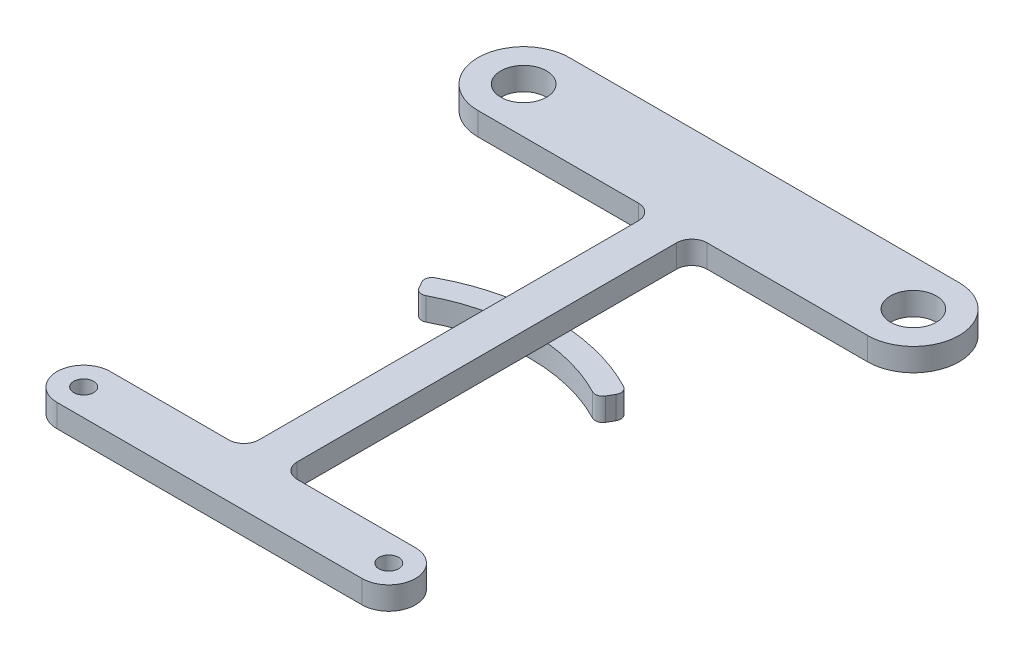
ISO-10303-21;
HEADER;
FILE_DESCRIPTION(('STEP AP214'),'2;1');
FILE_NAME('part.step','',(''),(''),'','','');
FILE_SCHEMA(('AUTOMOTIVE_DESIGN { 1 0 10303 214 1 1 1 1 }'));
ENDSEC;
DATA;
#1=APPLICATION_CONTEXT('core data for automotive mechanical design processes');
#2=APPLICATION_PROTOCOL_DEFINITION('international standard','automotive_design',2000,#1);
#3=PRODUCT_CONTEXT('',#1,'mechanical');
#4=PRODUCT('Part','Part','',(#3));
#5=PRODUCT_RELATED_PRODUCT_CATEGORY('part','',(#4));
#6=PRODUCT_DEFINITION_FORMATION('','',#4);
#7=PRODUCT_DEFINITION_CONTEXT('part definition',#1,'design');
#8=PRODUCT_DEFINITION('design','',#6,#7);
#9=PRODUCT_DEFINITION_SHAPE('','',#8);
#10=(LENGTH_UNIT() NAMED_UNIT(*) SI_UNIT(.MILLI.,.METRE.));
#11=(NAMED_UNIT(*) PLANE_ANGLE_UNIT() SI_UNIT($,.RADIAN.));
#12=(NAMED_UNIT(*) SI_UNIT($,.STERADIAN.) SOLID_ANGLE_UNIT());
#13=UNCERTAINTY_MEASURE_WITH_UNIT(LENGTH_MEASURE(1.E-05),#10,'distance_accuracy_value','');
#14=(GEOMETRIC_REPRESENTATION_CONTEXT(3) GLOBAL_UNCERTAINTY_ASSIGNED_CONTEXT((#13)) GLOBAL_UNIT_ASSIGNED_CONTEXT((#10,
#11,#12)) REPRESENTATION_CONTEXT('',''));
#15=CARTESIAN_POINT('',(0.,0.,0.));
#16=DIRECTION('',(0.,0.,1.));
#17=DIRECTION('',(1.,0.,0.));
#18=AXIS2_PLACEMENT_3D('',#15,#16,#17);
#19=CARTESIAN_POINT('',(-20.,0.,15.));
#20=DIRECTION('',(0.,1.,0.));
#21=DIRECTION('',(0.,0.,1.));
#22=AXIS2_PLACEMENT_3D('',#19,#20,#21);
#23=PLANE('',#22);
#24=CARTESIAN_POINT('',(25.55,0.,-48.24));
#25=DIRECTION('',(0.,1.,0.));
#26=DIRECTION('',(0.,0.,1.));
#27=AXIS2_PLACEMENT_3D('',#24,#25,#26);
#28=CIRCLE('',#27,3.);
#29=CARTESIAN_POINT('',(25.55,0.,-45.24));
#30=VERTEX_POINT('',#29);
#31=EDGE_CURVE('E627',#30,#30,#28,.T.);
#32=ORIENTED_EDGE('',*,*,#31,.T.);
#33=EDGE_LOOP('',(#32));
#34=FACE_BOUND('',#33,.T.);
#35=CARTESIAN_POINT('',(-25.55,0.,-48.24));
#36=DIRECTION('',(0.,1.,0.));
#37=DIRECTION('',(0.,0.,1.));
#38=AXIS2_PLACEMENT_3D('',#35,#36,#37);
#39=CIRCLE('',#38,3.);
#40=CARTESIAN_POINT('',(-25.55,0.,-45.24));
#41=VERTEX_POINT('',#40);
#42=EDGE_CURVE('E602',#41,#41,#39,.T.);
#43=ORIENTED_EDGE('',*,*,#42,.T.);
#44=EDGE_LOOP('',(#43));
#45=FACE_BOUND('',#44,.T.);
#46=DIRECTION('',(0.,0.,-1.));
#47=VECTOR('',#46,1.);
#48=CARTESIAN_POINT('',(2.5,0.,-42.2399996259733));
#49=LINE('',#48,#47);
#50=CARTESIAN_POINT('',(2.5,0.,-26.3818119165458));
#51=VERTEX_POINT('',#50);
#52=CARTESIAN_POINT('',(2.5,0.,-40.2399996259732));
#53=VERTEX_POINT('',#52);
#54=EDGE_CURVE('E245',#51,#53,#49,.T.);
#55=ORIENTED_EDGE('',*,*,#54,.F.);
#56=CARTESIAN_POINT('',(0.,0.,0.));
#57=DIRECTION('',(0.,1.,0.));
#58=DIRECTION('',(0.,0.,1.));
#59=AXIS2_PLACEMENT_3D('',#56,#57,#58);
#60=CIRCLE('',#59,26.5);
#61=CARTESIAN_POINT('',(-2.5,0.,-26.3818119165458));
#62=VERTEX_POINT('',#61);
#63=EDGE_CURVE('E231',#51,#62,#60,.T.);
#64=ORIENTED_EDGE('',*,*,#63,.T.);
#65=DIRECTION('',(0.,0.,1.));
#66=VECTOR('',#65,1.);
#67=CARTESIAN_POINT('',(-2.5,0.,-42.2399996259733));
#68=LINE('',#67,#66);
#69=CARTESIAN_POINT('',(-2.5,0.,-40.2399996259732));
#70=VERTEX_POINT('',#69);
#71=EDGE_CURVE('E280',#70,#62,#68,.T.);
#72=ORIENTED_EDGE('',*,*,#71,.F.);
#73=CARTESIAN_POINT('',(-4.5,0.,-40.2399996259732));
#74=DIRECTION('',(0.,1.,0.));
#75=DIRECTION('',(0.,0.,1.));
#76=AXIS2_PLACEMENT_3D('',#73,#74,#75);
#77=CIRCLE('',#76,2.);
#78=CARTESIAN_POINT('',(-4.5,0.,-42.2399996259733));
#79=VERTEX_POINT('',#78);
#80=EDGE_CURVE('E396',#70,#79,#77,.T.);
#81=ORIENTED_EDGE('',*,*,#80,.T.);
#82=DIRECTION('',(1.,0.,0.));
#83=VECTOR('',#82,1.);
#84=CARTESIAN_POINT('',(-25.55,0.,-42.2399996259732));
#85=LINE('',#84,#83);
#86=CARTESIAN_POINT('',(-25.55,0.,-42.2399996259732));
#87=VERTEX_POINT('',#86);
#88=EDGE_CURVE('E275',#87,#79,#85,.T.);
#89=ORIENTED_EDGE('',*,*,#88,.F.);
#90=CARTESIAN_POINT('',(-25.55,0.,-48.24));
#91=DIRECTION('',(0.,1.,0.));
#92=DIRECTION('',(0.,0.,1.));
#93=AXIS2_PLACEMENT_3D('',#90,#91,#92);
#94=CIRCLE('',#93,6.00000037402676);
#95=CARTESIAN_POINT('',(-25.55,0.,-54.2400003740268));
#96=VERTEX_POINT('',#95);
#97=EDGE_CURVE('E272',#96,#87,#94,.T.);
#98=ORIENTED_EDGE('',*,*,#97,.F.);
#99=DIRECTION('',(-1.,0.,0.));
#100=VECTOR('',#99,1.);
#101=CARTESIAN_POINT('',(-25.55,0.,-54.2400003740268));
#102=LINE('',#101,#100);
#103=CARTESIAN_POINT('',(25.55,0.,-54.2400003740268));
#104=VERTEX_POINT('',#103);
#105=EDGE_CURVE('E269',#104,#96,#102,.T.);
#106=ORIENTED_EDGE('',*,*,#105,.F.);
#107=CARTESIAN_POINT('',(25.55,0.,-48.24));
#108=DIRECTION('',(0.,1.,0.));
#109=DIRECTION('',(0.,0.,1.));
#110=AXIS2_PLACEMENT_3D('',#107,#108,#109);
#111=CIRCLE('',#110,6.00000037402676);
#112=CARTESIAN_POINT('',(25.55,0.,-42.2399996259732));
#113=VERTEX_POINT('',#112);
#114=EDGE_CURVE('E266',#113,#104,#111,.T.);
#115=ORIENTED_EDGE('',*,*,#114,.F.);
#116=DIRECTION('',(1.,0.,0.));
#117=VECTOR('',#116,1.);
#118=CARTESIAN_POINT('',(2.5,0.,-42.2399996259733));
#119=LINE('',#118,#117);
#120=CARTESIAN_POINT('',(4.5,0.,-42.2399996259733));
#121=VERTEX_POINT('',#120);
#122=EDGE_CURVE('E260',#121,#113,#119,.T.);
#123=ORIENTED_EDGE('',*,*,#122,.F.);
#124=CARTESIAN_POINT('',(4.5,0.,-40.2399996259732));
#125=DIRECTION('',(0.,1.,0.));
#126=DIRECTION('',(0.,0.,1.));
#127=AXIS2_PLACEMENT_3D('',#124,#125,#126);
#128=CIRCLE('',#127,2.);
#129=EDGE_CURVE('E247',#121,#53,#128,.T.);
#130=ORIENTED_EDGE('',*,*,#129,.T.);
#131=EDGE_LOOP('',(#55,#64,#72,#81,#89,#98,#106,#115,#123,#130));
#132=FACE_BOUND('',#131,.T.);
#133=ADVANCED_FACE('F43',(#34,#45,#132),#23,.F.);
#134=CARTESIAN_POINT('',(20.,0.,14.9999999999999));
#135=DIRECTION('',(0.,1.,0.));
#136=DIRECTION('',(0.,0.,1.));
#137=AXIS2_PLACEMENT_3D('',#134,#135,#136);
#138=CIRCLE('',#137,1.3);
#139=CARTESIAN_POINT('',(20.,0.,16.2999999999999));
#140=VERTEX_POINT('',#139);
#141=EDGE_CURVE('E633',#140,#140,#138,.T.);
#142=ORIENTED_EDGE('',*,*,#141,.T.);
#143=EDGE_LOOP('',(#142));
#144=FACE_BOUND('',#143,.T.);
#145=CARTESIAN_POINT('',(-20.,0.,15.));
#146=DIRECTION('',(0.,1.,0.));
#147=DIRECTION('',(0.,0.,1.));
#148=AXIS2_PLACEMENT_3D('',#145,#146,#147);
#149=CIRCLE('',#148,1.29999999999999);
#150=CARTESIAN_POINT('',(-20.,0.,16.3));
#151=VERTEX_POINT('',#150);
#152=EDGE_CURVE('E640',#151,#151,#149,.T.);
#153=ORIENTED_EDGE('',*,*,#152,.T.);
#154=EDGE_LOOP('',(#153));
#155=FACE_BOUND('',#154,.T.);
#156=CARTESIAN_POINT('',(-2.5,0.,-23.3666428910958));
#157=VERTEX_POINT('',#156);
#158=CARTESIAN_POINT('',(-2.49999999999999,0.,9.50000148501656));
#159=VERTEX_POINT('',#158);
#160=EDGE_CURVE('E279',#157,#159,#68,.T.);
#161=ORIENTED_EDGE('',*,*,#160,.F.);
#162=CARTESIAN_POINT('',(0.,0.,0.));
#163=DIRECTION('',(0.,-1.,0.));
#164=DIRECTION('',(0.,0.,1.));
#165=AXIS2_PLACEMENT_3D('',#162,#163,#164);
#166=CIRCLE('',#165,23.5);
#167=CARTESIAN_POINT('',(2.5,0.,-23.3666428910958));
#168=VERTEX_POINT('',#167);
#169=EDGE_CURVE('E243',#157,#168,#166,.T.);
#170=ORIENTED_EDGE('',*,*,#169,.T.);
#171=CARTESIAN_POINT('',(2.5,0.,9.50000234728425));
#172=VERTEX_POINT('',#171);
#173=EDGE_CURVE('E253',#172,#168,#49,.T.);
#174=ORIENTED_EDGE('',*,*,#173,.F.);
#175=CARTESIAN_POINT('',(4.5,0.,9.50000234728425));
#176=DIRECTION('',(0.,1.,0.));
#177=DIRECTION('',(0.,0.,1.));
#178=AXIS2_PLACEMENT_3D('',#175,#176,#177);
#179=CIRCLE('',#178,2.);
#180=CARTESIAN_POINT('',(4.49999980838496,0.,11.5000023472842));
#181=VERTEX_POINT('',#180);
#182=EDGE_CURVE('E407',#172,#181,#179,.T.);
#183=ORIENTED_EDGE('',*,*,#182,.T.);
#184=DIRECTION('',(-0.999999999999995,0.,-9.58075209445119E-08));
#185=VECTOR('',#184,1.);
#186=CARTESIAN_POINT('',(2.5,0.,11.5000021556692));
#187=LINE('',#186,#185);
#188=CARTESIAN_POINT('',(20.0000000000001,0.,11.5000038323008));
#189=VERTEX_POINT('',#188);
#190=EDGE_CURVE('E251',#189,#181,#187,.T.);
#191=ORIENTED_EDGE('',*,*,#190,.F.);
#192=CARTESIAN_POINT('',(20.,0.,14.9999999999999));
#193=DIRECTION('',(0.,1.,0.));
#194=DIRECTION('',(0.,0.,1.));
#195=AXIS2_PLACEMENT_3D('',#192,#193,#194);
#196=CIRCLE('',#195,3.49999616769917);
#197=CARTESIAN_POINT('',(20.0000000000001,0.,18.4999961676991));
#198=VERTEX_POINT('',#197);
#199=EDGE_CURVE('E445',#198,#189,#196,.T.);
#200=ORIENTED_EDGE('',*,*,#199,.F.);
#201=DIRECTION('',(0.999999999999995,0.,-9.5807520857776E-08));
#202=VECTOR('',#201,1.);
#203=CARTESIAN_POINT('',(-20.,0.,18.5));
#204=LINE('',#203,#202);
#205=CARTESIAN_POINT('',(-20.,0.,18.5));
#206=VERTEX_POINT('',#205);
#207=EDGE_CURVE('E442',#206,#198,#204,.T.);
#208=ORIENTED_EDGE('',*,*,#207,.F.);
#209=CARTESIAN_POINT('',(-20.,0.,15.));
#210=DIRECTION('',(0.,1.,0.));
#211=DIRECTION('',(0.,0.,1.));
#212=AXIS2_PLACEMENT_3D('',#209,#210,#211);
#213=CIRCLE('',#212,3.5);
#214=CARTESIAN_POINT('',(-20.,0.,11.5));
#215=VERTEX_POINT('',#214);
#216=EDGE_CURVE('E438',#215,#206,#213,.T.);
#217=ORIENTED_EDGE('',*,*,#216,.F.);
#218=DIRECTION('',(-0.999999999999995,0.,-9.58075208453854E-08));
#219=VECTOR('',#218,1.);
#220=CARTESIAN_POINT('',(-20.,0.,11.5));
#221=LINE('',#220,#219);
#222=CARTESIAN_POINT('',(-4.50000019161503,0.,11.5000014850166));
#223=VERTEX_POINT('',#222);
#224=EDGE_CURVE('E283',#223,#215,#221,.T.);
#225=ORIENTED_EDGE('',*,*,#224,.F.);
#226=CARTESIAN_POINT('',(-4.49999999999999,0.,9.50000148501656));
#227=DIRECTION('',(0.,1.,0.));
#228=DIRECTION('',(0.,0.,1.));
#229=AXIS2_PLACEMENT_3D('',#226,#227,#228);
#230=CIRCLE('',#229,2.);
#231=EDGE_CURVE('E52',#223,#159,#230,.T.);
#232=ORIENTED_EDGE('',*,*,#231,.T.);
#233=EDGE_LOOP('',(#161,#170,#174,#183,#191,#200,#208,#217,#225,#232));
#234=FACE_BOUND('',#233,.T.);
#235=ADVANCED_FACE('F417',(#144,#155,#234),#23,.F.);
#236=CARTESIAN_POINT('',(-20.,3.,15.));
#237=DIRECTION('',(0.,1.,0.));
#238=DIRECTION('',(0.,0.,1.));
#239=AXIS2_PLACEMENT_3D('',#236,#237,#238);
#240=PLANE('',#239);
#241=CARTESIAN_POINT('',(25.55,3.,-48.24));
#242=DIRECTION('',(0.,1.,0.));
#243=DIRECTION('',(0.,0.,1.));
#244=AXIS2_PLACEMENT_3D('',#241,#242,#243);
#245=CIRCLE('',#244,3.);
#246=CARTESIAN_POINT('',(25.55,3.,-45.24));
#247=VERTEX_POINT('',#246);
#248=EDGE_CURVE('E629',#247,#247,#245,.T.);
#249=ORIENTED_EDGE('',*,*,#248,.F.);
#250=EDGE_LOOP('',(#249));
#251=FACE_BOUND('',#250,.T.);
#252=CARTESIAN_POINT('',(-20.,3.,15.));
#253=DIRECTION('',(0.,1.,0.));
#254=DIRECTION('',(0.,0.,1.));
#255=AXIS2_PLACEMENT_3D('',#252,#253,#254);
#256=CIRCLE('',#255,1.29999999999999);
#257=CARTESIAN_POINT('',(-20.,3.,16.3));
#258=VERTEX_POINT('',#257);
#259=EDGE_CURVE('E443',#258,#258,#256,.T.);
#260=ORIENTED_EDGE('',*,*,#259,.F.);
#261=EDGE_LOOP('',(#260));
#262=FACE_BOUND('',#261,.T.);
#263=CARTESIAN_POINT('',(-20.,3.,15.));
#264=DIRECTION('',(0.,1.,0.));
#265=DIRECTION('',(0.,0.,1.));
#266=AXIS2_PLACEMENT_3D('',#263,#264,#265);
#267=CIRCLE('',#266,3.5);
#268=CARTESIAN_POINT('',(-20.,3.,11.5));
#269=VERTEX_POINT('',#268);
#270=CARTESIAN_POINT('',(-20.,3.,18.5));
#271=VERTEX_POINT('',#270);
#272=EDGE_CURVE('E287',#269,#271,#267,.T.);
#273=ORIENTED_EDGE('',*,*,#272,.T.);
#274=DIRECTION('',(0.999999999999995,0.,-9.5807520857776E-08));
#275=VECTOR('',#274,1.);
#276=CARTESIAN_POINT('',(-20.,3.,18.5));
#277=LINE('',#276,#275);
#278=CARTESIAN_POINT('',(20.0000000000001,3.,18.4999961676991));
#279=VERTEX_POINT('',#278);
#280=EDGE_CURVE('E652',#271,#279,#277,.T.);
#281=ORIENTED_EDGE('',*,*,#280,.T.);
#282=CARTESIAN_POINT('',(20.,3.,14.9999999999999));
#283=DIRECTION('',(0.,1.,0.));
#284=DIRECTION('',(0.,0.,1.));
#285=AXIS2_PLACEMENT_3D('',#282,#283,#284);
#286=CIRCLE('',#285,3.49999616769917);
#287=CARTESIAN_POINT('',(20.0000000000001,3.,11.5000038323008));
#288=VERTEX_POINT('',#287);
#289=EDGE_CURVE('E476',#279,#288,#286,.T.);
#290=ORIENTED_EDGE('',*,*,#289,.T.);
#291=DIRECTION('',(-0.999999999999995,0.,-9.58075209445119E-08));
#292=VECTOR('',#291,1.);
#293=CARTESIAN_POINT('',(2.5,3.,11.5000021556692));
#294=LINE('',#293,#292);
#295=CARTESIAN_POINT('',(4.49999980838496,3.,11.5000023472842));
#296=VERTEX_POINT('',#295);
#297=EDGE_CURVE('E468',#288,#296,#294,.T.);
#298=ORIENTED_EDGE('',*,*,#297,.T.);
#299=CARTESIAN_POINT('',(4.5,3.,9.50000234728425));
#300=DIRECTION('',(0.,1.,0.));
#301=DIRECTION('',(0.,0.,1.));
#302=AXIS2_PLACEMENT_3D('',#299,#300,#301);
#303=CIRCLE('',#302,2.);
#304=CARTESIAN_POINT('',(2.5,3.,9.50000234728425));
#305=VERTEX_POINT('',#304);
#306=EDGE_CURVE('E410',#296,#305,#303,.F.);
#307=ORIENTED_EDGE('',*,*,#306,.T.);
#308=DIRECTION('',(0.,0.,-1.));
#309=VECTOR('',#308,1.);
#310=CARTESIAN_POINT('',(2.5,3.,-42.2399996259733));
#311=LINE('',#310,#309);
#312=CARTESIAN_POINT('',(2.5,3.,-40.2399996259732));
#313=VERTEX_POINT('',#312);
#314=EDGE_CURVE('E466',#305,#313,#311,.T.);
#315=ORIENTED_EDGE('',*,*,#314,.T.);
#316=CARTESIAN_POINT('',(4.5,3.,-40.2399996259732));
#317=DIRECTION('',(0.,1.,0.));
#318=DIRECTION('',(0.,0.,1.));
#319=AXIS2_PLACEMENT_3D('',#316,#317,#318);
#320=CIRCLE('',#319,2.);
#321=CARTESIAN_POINT('',(4.5,3.,-42.2399996259733));
#322=VERTEX_POINT('',#321);
#323=EDGE_CURVE('E404',#313,#322,#320,.F.);
#324=ORIENTED_EDGE('',*,*,#323,.T.);
#325=DIRECTION('',(1.,0.,0.));
#326=VECTOR('',#325,1.);
#327=CARTESIAN_POINT('',(2.5,3.,-42.2399996259733));
#328=LINE('',#327,#326);
#329=CARTESIAN_POINT('',(25.55,3.,-42.2399996259732));
#330=VERTEX_POINT('',#329);
#331=EDGE_CURVE('E470',#322,#330,#328,.T.);
#332=ORIENTED_EDGE('',*,*,#331,.T.);
#333=CARTESIAN_POINT('',(25.55,3.,-48.24));
#334=DIRECTION('',(0.,1.,0.));
#335=DIRECTION('',(0.,0.,1.));
#336=AXIS2_PLACEMENT_3D('',#333,#334,#335);
#337=CIRCLE('',#336,6.00000037402676);
#338=CARTESIAN_POINT('',(25.55,3.,-54.2400003740268));
#339=VERTEX_POINT('',#338);
#340=EDGE_CURVE('E474',#330,#339,#337,.T.);
#341=ORIENTED_EDGE('',*,*,#340,.T.);
#342=DIRECTION('',(-1.,0.,0.));
#343=VECTOR('',#342,1.);
#344=CARTESIAN_POINT('',(-25.55,3.,-54.2400003740268));
#345=LINE('',#344,#343);
#346=CARTESIAN_POINT('',(-25.55,3.,-54.2400003740268));
#347=VERTEX_POINT('',#346);
#348=EDGE_CURVE('E482',#339,#347,#345,.T.);
#349=ORIENTED_EDGE('',*,*,#348,.T.);
#350=CARTESIAN_POINT('',(-25.55,3.,-48.24));
#351=DIRECTION('',(0.,1.,0.));
#352=DIRECTION('',(0.,0.,1.));
#353=AXIS2_PLACEMENT_3D('',#350,#351,#352);
#354=CIRCLE('',#353,6.00000037402676);
#355=CARTESIAN_POINT('',(-25.55,3.,-42.2399996259732));
#356=VERTEX_POINT('',#355);
#357=EDGE_CURVE('E485',#347,#356,#354,.T.);
#358=ORIENTED_EDGE('',*,*,#357,.T.);
#359=DIRECTION('',(1.,0.,0.));
#360=VECTOR('',#359,1.);
#361=CARTESIAN_POINT('',(-25.55,3.,-42.2399996259732));
#362=LINE('',#361,#360);
#363=CARTESIAN_POINT('',(-4.5,3.,-42.2399996259733));
#364=VERTEX_POINT('',#363);
#365=EDGE_CURVE('E434',#356,#364,#362,.T.);
#366=ORIENTED_EDGE('',*,*,#365,.T.);
#367=CARTESIAN_POINT('',(-4.5,3.,-40.2399996259732));
#368=DIRECTION('',(0.,1.,0.));
#369=DIRECTION('',(0.,0.,1.));
#370=AXIS2_PLACEMENT_3D('',#367,#368,#369);
#371=CIRCLE('',#370,2.);
#372=CARTESIAN_POINT('',(-2.5,3.,-40.2399996259732));
#373=VERTEX_POINT('',#372);
#374=EDGE_CURVE('E399',#364,#373,#371,.F.);
#375=ORIENTED_EDGE('',*,*,#374,.T.);
#376=DIRECTION('',(0.,0.,1.));
#377=VECTOR('',#376,1.);
#378=CARTESIAN_POINT('',(-2.5,3.,-42.2399996259733));
#379=LINE('',#378,#377);
#380=CARTESIAN_POINT('',(-2.49999999999999,3.,9.50000148501656));
#381=VERTEX_POINT('',#380);
#382=EDGE_CURVE('E431',#373,#381,#379,.T.);
#383=ORIENTED_EDGE('',*,*,#382,.T.);
#384=CARTESIAN_POINT('',(-4.49999999999999,3.,9.50000148501656));
#385=DIRECTION('',(0.,1.,0.));
#386=DIRECTION('',(0.,0.,1.));
#387=AXIS2_PLACEMENT_3D('',#384,#385,#386);
#388=CIRCLE('',#387,2.);
#389=CARTESIAN_POINT('',(-4.50000019161503,3.,11.5000014850166));
#390=VERTEX_POINT('',#389);
#391=EDGE_CURVE('E11',#381,#390,#388,.F.);
#392=ORIENTED_EDGE('',*,*,#391,.T.);
#393=DIRECTION('',(-0.999999999999995,0.,-9.58075208453854E-08));
#394=VECTOR('',#393,1.);
#395=CARTESIAN_POINT('',(-20.,3.,11.5));
#396=LINE('',#395,#394);
#397=EDGE_CURVE('E293',#390,#269,#396,.T.);
#398=ORIENTED_EDGE('',*,*,#397,.T.);
#399=EDGE_LOOP('',(#273,#281,#290,#298,#307,#315,#324,#332,#341,#349,#358,#366,#375,#383,#392,#398));
#400=FACE_BOUND('',#399,.T.);
#401=CARTESIAN_POINT('',(20.,3.,14.9999999999999));
#402=DIRECTION('',(0.,1.,0.));
#403=DIRECTION('',(0.,0.,1.));
#404=AXIS2_PLACEMENT_3D('',#401,#402,#403);
#405=CIRCLE('',#404,1.3);
#406=CARTESIAN_POINT('',(20.,3.,16.2999999999999));
#407=VERTEX_POINT('',#406);
#408=EDGE_CURVE('E636',#407,#407,#405,.T.);
#409=ORIENTED_EDGE('',*,*,#408,.F.);
#410=EDGE_LOOP('',(#409));
#411=FACE_BOUND('',#410,.T.);
#412=CARTESIAN_POINT('',(-25.55,3.,-48.24));
#413=DIRECTION('',(0.,1.,0.));
#414=DIRECTION('',(0.,0.,1.));
#415=AXIS2_PLACEMENT_3D('',#412,#413,#414);
#416=CIRCLE('',#415,3.);
#417=CARTESIAN_POINT('',(-25.55,3.,-45.24));
#418=VERTEX_POINT('',#417);
#419=EDGE_CURVE('E608',#418,#418,#416,.T.);
#420=ORIENTED_EDGE('',*,*,#419,.F.);
#421=EDGE_LOOP('',(#420));
#422=FACE_BOUND('',#421,.T.);
#423=ADVANCED_FACE('F464',(#251,#262,#400,#411,#422),#240,.T.);
#424=CARTESIAN_POINT('',(-20.,3.,15.));
#425=DIRECTION('',(0.,-1.,0.));
#426=DIRECTION('',(0.,0.,-1.));
#427=AXIS2_PLACEMENT_3D('',#424,#425,#426);
#428=CYLINDRICAL_SURFACE('',#427,3.5);
#429=ORIENTED_EDGE('',*,*,#216,.T.);
#430=DIRECTION('',(0.,-1.,0.));
#431=VECTOR('',#430,1.);
#432=CARTESIAN_POINT('',(-20.,3.,18.5));
#433=LINE('',#432,#431);
#434=EDGE_CURVE('E317',#271,#206,#433,.T.);
#435=ORIENTED_EDGE('',*,*,#434,.F.);
#436=ORIENTED_EDGE('',*,*,#272,.F.);
#437=DIRECTION('',(0.,-1.,0.));
#438=VECTOR('',#437,1.);
#439=CARTESIAN_POINT('',(-20.,3.,11.5));
#440=LINE('',#439,#438);
#441=EDGE_CURVE('E288',#269,#215,#440,.T.);
#442=ORIENTED_EDGE('',*,*,#441,.T.);
#443=EDGE_LOOP('',(#429,#435,#436,#442));
#444=FACE_BOUND('',#443,.T.);
#445=ADVANCED_FACE('F565',(#444),#428,.T.);
#446=CARTESIAN_POINT('',(-20.,3.,18.5));
#447=DIRECTION('',(-9.5807520857776E-08,0.,-0.999999999999995));
#448=DIRECTION('',(-0.999999999999996,0.,9.5807520857776E-08));
#449=AXIS2_PLACEMENT_3D('',#446,#447,#448);
#450=PLANE('',#449);
#451=ORIENTED_EDGE('',*,*,#207,.T.);
#452=DIRECTION('',(0.,-1.,0.));
#453=VECTOR('',#452,1.);
#454=CARTESIAN_POINT('',(20.0000000000001,3.,18.4999961676991));
#455=LINE('',#454,#453);
#456=EDGE_CURVE('E313',#279,#198,#455,.T.);
#457=ORIENTED_EDGE('',*,*,#456,.F.);
#458=ORIENTED_EDGE('',*,*,#280,.F.);
#459=ORIENTED_EDGE('',*,*,#434,.T.);
#460=EDGE_LOOP('',(#451,#457,#458,#459));
#461=FACE_BOUND('',#460,.T.);
#462=ADVANCED_FACE('F562',(#461),#450,.F.);
#463=CARTESIAN_POINT('',(20.,3.,14.9999999999999));
#464=DIRECTION('',(0.,-1.,0.));
#465=DIRECTION('',(0.,0.,-1.));
#466=AXIS2_PLACEMENT_3D('',#463,#464,#465);
#467=CYLINDRICAL_SURFACE('',#466,3.49999616769917);
#468=ORIENTED_EDGE('',*,*,#199,.T.);
#469=DIRECTION('',(0.,-1.,0.));
#470=VECTOR('',#469,1.);
#471=CARTESIAN_POINT('',(20.0000000000001,3.,11.5000038323008));
#472=LINE('',#471,#470);
#473=EDGE_CURVE('E309',#288,#189,#472,.T.);
#474=ORIENTED_EDGE('',*,*,#473,.F.);
#475=ORIENTED_EDGE('',*,*,#289,.F.);
#476=ORIENTED_EDGE('',*,*,#456,.T.);
#477=EDGE_LOOP('',(#468,#474,#475,#476));
#478=FACE_BOUND('',#477,.T.);
#479=ADVANCED_FACE('F559',(#478),#467,.T.);
#480=CARTESIAN_POINT('',(2.5,3.,11.5000021556692));
#481=DIRECTION('',(-9.58075209445119E-08,0.,0.999999999999995));
#482=DIRECTION('',(0.999999999999996,0.,9.58075209445119E-08));
#483=AXIS2_PLACEMENT_3D('',#480,#481,#482);
#484=PLANE('',#483);
#485=ORIENTED_EDGE('',*,*,#190,.T.);
#486=DIRECTION('',(0.,-1.,0.));
#487=VECTOR('',#486,1.);
#488=CARTESIAN_POINT('',(4.49999980838496,3.,11.5000023472842));
#489=LINE('',#488,#487);
#490=EDGE_CURVE('E390',#181,#296,#489,.F.);
#491=ORIENTED_EDGE('',*,*,#490,.T.);
#492=ORIENTED_EDGE('',*,*,#297,.F.);
#493=ORIENTED_EDGE('',*,*,#473,.T.);
#494=EDGE_LOOP('',(#485,#491,#492,#493));
#495=FACE_BOUND('',#494,.T.);
#496=ADVANCED_FACE('F455',(#495),#484,.F.);
#497=CARTESIAN_POINT('',(2.5,3.,-42.2399996259733));
#498=DIRECTION('',(-1.,0.,0.));
#499=DIRECTION('',(0.,0.,1.));
#500=AXIS2_PLACEMENT_3D('',#497,#498,#499);
#501=PLANE('',#500);
#502=ORIENTED_EDGE('',*,*,#54,.T.);
#503=DIRECTION('',(0.,-1.,0.));
#504=VECTOR('',#503,1.);
#505=CARTESIAN_POINT('',(2.5,3.,-40.2399996259732));
#506=LINE('',#505,#504);
#507=EDGE_CURVE('E387',#53,#313,#506,.F.);
#508=ORIENTED_EDGE('',*,*,#507,.T.);
#509=ORIENTED_EDGE('',*,*,#314,.F.);
#510=DIRECTION('',(0.,-1.,0.));
#511=VECTOR('',#510,1.);
#512=CARTESIAN_POINT('',(2.5,0.,9.50000234728425));
#513=LINE('',#512,#511);
#514=EDGE_CURVE('E384',#305,#172,#513,.T.);
#515=ORIENTED_EDGE('',*,*,#514,.T.);
#516=ORIENTED_EDGE('',*,*,#173,.T.);
#517=EDGE_CURVE('E221',#168,#51,#49,.T.);
#518=ORIENTED_EDGE('',*,*,#517,.T.);
#519=EDGE_LOOP('',(#502,#508,#509,#515,#516,#518));
#520=FACE_BOUND('',#519,.T.);
#521=ADVANCED_FACE('F254',(#520),#501,.F.);
#522=CARTESIAN_POINT('',(2.5,3.,-42.2399996259733));
#523=DIRECTION('',(0.,0.,-1.));
#524=DIRECTION('',(-1.,0.,0.));
#525=AXIS2_PLACEMENT_3D('',#522,#523,#524);
#526=PLANE('',#525);
#527=ORIENTED_EDGE('',*,*,#331,.F.);
#528=DIRECTION('',(0.,-1.,0.));
#529=VECTOR('',#528,1.);
#530=CARTESIAN_POINT('',(4.5,0.,-42.2399996259733));
#531=LINE('',#530,#529);
#532=EDGE_CURVE('E380',#322,#121,#531,.T.);
#533=ORIENTED_EDGE('',*,*,#532,.T.);
#534=ORIENTED_EDGE('',*,*,#122,.T.);
#535=DIRECTION('',(0.,-1.,0.));
#536=VECTOR('',#535,1.);
#537=CARTESIAN_POINT('',(25.55,3.,-42.2399996259732));
#538=LINE('',#537,#536);
#539=EDGE_CURVE('E305',#330,#113,#538,.T.);
#540=ORIENTED_EDGE('',*,*,#539,.F.);
#541=EDGE_LOOP('',(#527,#533,#534,#540));
#542=FACE_BOUND('',#541,.T.);
#543=ADVANCED_FACE('F516',(#542),#526,.F.);
#544=CARTESIAN_POINT('',(25.55,3.,-48.24));
#545=DIRECTION('',(0.,-1.,0.));
#546=DIRECTION('',(0.,0.,-1.));
#547=AXIS2_PLACEMENT_3D('',#544,#545,#546);
#548=CYLINDRICAL_SURFACE('',#547,6.00000037402676);
#549=ORIENTED_EDGE('',*,*,#114,.T.);
#550=DIRECTION('',(0.,-1.,0.));
#551=VECTOR('',#550,1.);
#552=CARTESIAN_POINT('',(25.55,3.,-54.2400003740268));
#553=LINE('',#552,#551);
#554=EDGE_CURVE('E301',#339,#104,#553,.T.);
#555=ORIENTED_EDGE('',*,*,#554,.F.);
#556=ORIENTED_EDGE('',*,*,#340,.F.);
#557=ORIENTED_EDGE('',*,*,#539,.T.);
#558=EDGE_LOOP('',(#549,#555,#556,#557));
#559=FACE_BOUND('',#558,.T.);
#560=ADVANCED_FACE('F512',(#559),#548,.T.);
#561=CARTESIAN_POINT('',(-25.55,3.,-54.2400003740268));
#562=DIRECTION('',(0.,0.,1.));
#563=DIRECTION('',(1.,0.,0.));
#564=AXIS2_PLACEMENT_3D('',#561,#562,#563);
#565=PLANE('',#564);
#566=ORIENTED_EDGE('',*,*,#105,.T.);
#567=DIRECTION('',(0.,-1.,0.));
#568=VECTOR('',#567,1.);
#569=CARTESIAN_POINT('',(-25.55,3.,-54.2400003740268));
#570=LINE('',#569,#568);
#571=EDGE_CURVE('E297',#347,#96,#570,.T.);
#572=ORIENTED_EDGE('',*,*,#571,.F.);
#573=ORIENTED_EDGE('',*,*,#348,.F.);
#574=ORIENTED_EDGE('',*,*,#554,.T.);
#575=EDGE_LOOP('',(#566,#572,#573,#574));
#576=FACE_BOUND('',#575,.T.);
#577=ADVANCED_FACE('F507',(#576),#565,.F.);
#578=CARTESIAN_POINT('',(-25.55,3.,-48.24));
#579=DIRECTION('',(0.,-1.,0.));
#580=DIRECTION('',(0.,0.,-1.));
#581=AXIS2_PLACEMENT_3D('',#578,#579,#580);
#582=CYLINDRICAL_SURFACE('',#581,6.00000037402676);
#583=ORIENTED_EDGE('',*,*,#97,.T.);
#584=DIRECTION('',(0.,-1.,0.));
#585=VECTOR('',#584,1.);
#586=CARTESIAN_POINT('',(-25.55,3.,-42.2399996259732));
#587=LINE('',#586,#585);
#588=EDGE_CURVE('E292',#356,#87,#587,.T.);
#589=ORIENTED_EDGE('',*,*,#588,.F.);
#590=ORIENTED_EDGE('',*,*,#357,.F.);
#591=ORIENTED_EDGE('',*,*,#571,.T.);
#592=EDGE_LOOP('',(#583,#589,#590,#591));
#593=FACE_BOUND('',#592,.T.);
#594=ADVANCED_FACE('F502',(#593),#582,.T.);
#595=CARTESIAN_POINT('',(-25.55,3.,-42.2399996259732));
#596=DIRECTION('',(0.,0.,-1.));
#597=DIRECTION('',(-1.,0.,0.));
#598=AXIS2_PLACEMENT_3D('',#595,#596,#597);
#599=PLANE('',#598);
#600=ORIENTED_EDGE('',*,*,#88,.T.);
#601=DIRECTION('',(0.,-1.,0.));
#602=VECTOR('',#601,1.);
#603=CARTESIAN_POINT('',(-4.5,3.,-42.2399996259733));
#604=LINE('',#603,#602);
#605=EDGE_CURVE('E377',#79,#364,#604,.F.);
#606=ORIENTED_EDGE('',*,*,#605,.T.);
#607=ORIENTED_EDGE('',*,*,#365,.F.);
#608=ORIENTED_EDGE('',*,*,#588,.T.);
#609=EDGE_LOOP('',(#600,#606,#607,#608));
#610=FACE_BOUND('',#609,.T.);
#611=ADVANCED_FACE('F500',(#610),#599,.F.);
#612=CARTESIAN_POINT('',(-2.5,3.,-42.2399996259733));
#613=DIRECTION('',(1.,0.,0.));
#614=DIRECTION('',(0.,0.,-1.));
#615=AXIS2_PLACEMENT_3D('',#612,#613,#614);
#616=PLANE('',#615);
#617=ORIENTED_EDGE('',*,*,#382,.F.);
#618=DIRECTION('',(0.,-1.,0.));
#619=VECTOR('',#618,1.);
#620=CARTESIAN_POINT('',(-2.5,0.,-40.2399996259732));
#621=LINE('',#620,#619);
#622=EDGE_CURVE('E373',#373,#70,#621,.T.);
#623=ORIENTED_EDGE('',*,*,#622,.T.);
#624=ORIENTED_EDGE('',*,*,#71,.T.);
#625=EDGE_CURVE('E284',#62,#157,#68,.T.);
#626=ORIENTED_EDGE('',*,*,#625,.T.);
#627=ORIENTED_EDGE('',*,*,#160,.T.);
#628=DIRECTION('',(0.,-1.,0.));
#629=VECTOR('',#628,1.);
#630=CARTESIAN_POINT('',(-2.49999999999999,3.,9.50000148501656));
#631=LINE('',#630,#629);
#632=EDGE_CURVE('E370',#159,#381,#631,.F.);
#633=ORIENTED_EDGE('',*,*,#632,.T.);
#634=EDGE_LOOP('',(#617,#623,#624,#626,#627,#633));
#635=FACE_BOUND('',#634,.T.);
#636=ADVANCED_FACE('F422',(#635),#616,.F.);
#637=CARTESIAN_POINT('',(-20.,3.,11.5));
#638=DIRECTION('',(-9.58075208453853E-08,0.,0.999999999999995));
#639=DIRECTION('',(0.999999999999996,0.,9.58075208453854E-08));
#640=AXIS2_PLACEMENT_3D('',#637,#638,#639);
#641=PLANE('',#640);
#642=ORIENTED_EDGE('',*,*,#397,.F.);
#643=DIRECTION('',(0.,-1.,0.));
#644=VECTOR('',#643,1.);
#645=CARTESIAN_POINT('',(-4.50000019161503,0.,11.5000014850166));
#646=LINE('',#645,#644);
#647=EDGE_CURVE('E393',#390,#223,#646,.T.);
#648=ORIENTED_EDGE('',*,*,#647,.T.);
#649=ORIENTED_EDGE('',*,*,#224,.T.);
#650=ORIENTED_EDGE('',*,*,#441,.F.);
#651=EDGE_LOOP('',(#642,#648,#649,#650));
#652=FACE_BOUND('',#651,.T.);
#653=ADVANCED_FACE('F426',(#652),#641,.F.);
#654=CARTESIAN_POINT('',(-20.,3.,15.));
#655=DIRECTION('',(0.,-1.,0.));
#656=DIRECTION('',(0.,0.,-1.));
#657=AXIS2_PLACEMENT_3D('',#654,#655,#656);
#658=CYLINDRICAL_SURFACE('',#657,1.29999999999999);
#659=ORIENTED_EDGE('',*,*,#259,.T.);
#660=EDGE_LOOP('',(#659));
#661=FACE_BOUND('',#660,.T.);
#662=ORIENTED_EDGE('',*,*,#152,.F.);
#663=EDGE_LOOP('',(#662));
#664=FACE_BOUND('',#663,.T.);
#665=ADVANCED_FACE('F542',(#661,#664),#658,.F.);
#666=CARTESIAN_POINT('',(20.,3.,14.9999999999999));
#667=DIRECTION('',(0.,-1.,0.));
#668=DIRECTION('',(0.,0.,-1.));
#669=AXIS2_PLACEMENT_3D('',#666,#667,#668);
#670=CYLINDRICAL_SURFACE('',#669,1.3);
#671=ORIENTED_EDGE('',*,*,#408,.T.);
#672=EDGE_LOOP('',(#671));
#673=FACE_BOUND('',#672,.T.);
#674=ORIENTED_EDGE('',*,*,#141,.F.);
#675=EDGE_LOOP('',(#674));
#676=FACE_BOUND('',#675,.T.);
#677=ADVANCED_FACE('F663',(#673,#676),#670,.F.);
#678=CARTESIAN_POINT('',(25.55,3.,-48.24));
#679=DIRECTION('',(0.,-1.,0.));
#680=DIRECTION('',(0.,0.,-1.));
#681=AXIS2_PLACEMENT_3D('',#678,#679,#680);
#682=CYLINDRICAL_SURFACE('',#681,3.);
#683=ORIENTED_EDGE('',*,*,#248,.T.);
#684=EDGE_LOOP('',(#683));
#685=FACE_BOUND('',#684,.T.);
#686=ORIENTED_EDGE('',*,*,#31,.F.);
#687=EDGE_LOOP('',(#686));
#688=FACE_BOUND('',#687,.T.);
#689=ADVANCED_FACE('F668',(#685,#688),#682,.F.);
#690=CARTESIAN_POINT('',(-25.55,3.,-48.24));
#691=DIRECTION('',(0.,-1.,0.));
#692=DIRECTION('',(0.,0.,-1.));
#693=AXIS2_PLACEMENT_3D('',#690,#691,#692);
#694=CYLINDRICAL_SURFACE('',#693,3.);
#695=ORIENTED_EDGE('',*,*,#419,.T.);
#696=EDGE_LOOP('',(#695));
#697=FACE_BOUND('',#696,.T.);
#698=ORIENTED_EDGE('',*,*,#42,.F.);
#699=EDGE_LOOP('',(#698));
#700=FACE_BOUND('',#699,.T.);
#701=ADVANCED_FACE('F674',(#697,#700),#694,.F.);
#702=CARTESIAN_POINT('',(0.,0.,0.));
#703=DIRECTION('',(0.,1.,0.));
#704=DIRECTION('',(0.,0.,1.));
#705=AXIS2_PLACEMENT_3D('',#702,#703,#704);
#706=PLANE('',#705);
#707=DIRECTION('',(0.500000000000001,0.,0.866025403784438));
#708=VECTOR('',#707,1.);
#709=CARTESIAN_POINT('',(-11.75,0.,-20.3515969889343));
#710=LINE('',#709,#708);
#711=CARTESIAN_POINT('',(-12.7401923062409,0.,-22.0666603726073));
#712=VERTEX_POINT('',#711);
#713=CARTESIAN_POINT('',(-12.2397916648937,0.,-21.1999410376538));
#714=VERTEX_POINT('',#713);
#715=EDGE_CURVE('E228',#712,#714,#710,.T.);
#716=ORIENTED_EDGE('',*,*,#715,.T.);
#717=CARTESIAN_POINT('',(-11.3737662611092,0.,-21.6999410376538));
#718=DIRECTION('',(0.,1.,0.));
#719=DIRECTION('',(0.,0.,1.));
#720=AXIS2_PLACEMENT_3D('',#717,#718,#719);
#721=CIRCLE('',#720,1.);
#722=CARTESIAN_POINT('',(-10.9095309035129,0.,-20.8142291585659));
#723=VERTEX_POINT('',#722);
#724=EDGE_CURVE('E330',#714,#723,#721,.T.);
#725=ORIENTED_EDGE('',*,*,#724,.T.);
#726=EDGE_CURVE('E619',#723,#157,#166,.T.);
#727=ORIENTED_EDGE('',*,*,#726,.T.);
#728=ORIENTED_EDGE('',*,*,#625,.F.);
#729=CARTESIAN_POINT('',(-12.3398205064744,0.,-23.4516274460429));
#730=VERTEX_POINT('',#729);
#731=EDGE_CURVE('E229',#62,#730,#60,.T.);
#732=ORIENTED_EDGE('',*,*,#731,.T.);
#733=CARTESIAN_POINT('',(-11.8741669024565,0.,-22.5666603726073));
#734=DIRECTION('',(0.,1.,0.));
#735=DIRECTION('',(0.,0.,1.));
#736=AXIS2_PLACEMENT_3D('',#733,#734,#735);
#737=CIRCLE('',#736,1.);
#738=EDGE_CURVE('E327',#730,#712,#737,.T.);
#739=ORIENTED_EDGE('',*,*,#738,.T.);
#740=EDGE_LOOP('',(#716,#725,#727,#728,#732,#739));
#741=FACE_BOUND('',#740,.T.);
#742=ADVANCED_FACE('F678',(#741),#706,.T.);
#743=CARTESIAN_POINT('',(10.9095309035129,0.,-20.8142291585659));
#744=VERTEX_POINT('',#743);
#745=EDGE_CURVE('E618',#168,#744,#166,.T.);
#746=ORIENTED_EDGE('',*,*,#745,.T.);
#747=CARTESIAN_POINT('',(11.3737662611092,0.,-21.6999410376538));
#748=DIRECTION('',(0.,1.,0.));
#749=DIRECTION('',(0.,0.,1.));
#750=AXIS2_PLACEMENT_3D('',#747,#748,#749);
#751=CIRCLE('',#750,1.);
#752=CARTESIAN_POINT('',(12.2397916648937,0.,-21.1999410376538));
#753=VERTEX_POINT('',#752);
#754=EDGE_CURVE('E360',#744,#753,#751,.T.);
#755=ORIENTED_EDGE('',*,*,#754,.T.);
#756=DIRECTION('',(0.500000000000001,0.,-0.866025403784438));
#757=VECTOR('',#756,1.);
#758=CARTESIAN_POINT('',(13.25,0.,-22.9496732002876));
#759=LINE('',#758,#757);
#760=CARTESIAN_POINT('',(12.7401923062409,0.,-22.0666603726073));
#761=VERTEX_POINT('',#760);
#762=EDGE_CURVE('E622',#753,#761,#759,.T.);
#763=ORIENTED_EDGE('',*,*,#762,.T.);
#764=CARTESIAN_POINT('',(11.8741669024565,0.,-22.5666603726073));
#765=DIRECTION('',(0.,1.,0.));
#766=DIRECTION('',(0.,0.,1.));
#767=AXIS2_PLACEMENT_3D('',#764,#765,#766);
#768=CIRCLE('',#767,1.);
#769=CARTESIAN_POINT('',(12.3398205064744,0.,-23.4516274460429));
#770=VERTEX_POINT('',#769);
#771=EDGE_CURVE('E224',#761,#770,#768,.T.);
#772=ORIENTED_EDGE('',*,*,#771,.T.);
#773=EDGE_CURVE('E216',#770,#51,#60,.T.);
#774=ORIENTED_EDGE('',*,*,#773,.T.);
#775=ORIENTED_EDGE('',*,*,#517,.F.);
#776=EDGE_LOOP('',(#746,#755,#763,#772,#774,#775));
#777=FACE_BOUND('',#776,.T.);
#778=ADVANCED_FACE('F219',(#777),#706,.T.);
#779=CARTESIAN_POINT('',(0.,-3.,0.));
#780=DIRECTION('',(0.,1.,0.));
#781=DIRECTION('',(0.,0.,1.));
#782=AXIS2_PLACEMENT_3D('',#779,#780,#781);
#783=CYLINDRICAL_SURFACE('',#782,26.5);
#784=CARTESIAN_POINT('',(0.,-3.,0.));
#785=DIRECTION('',(0.,1.,0.));
#786=DIRECTION('',(0.,0.,1.));
#787=AXIS2_PLACEMENT_3D('',#784,#785,#786);
#788=CIRCLE('',#787,26.5);
#789=CARTESIAN_POINT('',(12.3398205064744,-3.,-23.4516274460429));
#790=VERTEX_POINT('',#789);
#791=CARTESIAN_POINT('',(-12.3398205064744,-3.,-23.4516274460429));
#792=VERTEX_POINT('',#791);
#793=EDGE_CURVE('E596',#790,#792,#788,.T.);
#794=ORIENTED_EDGE('',*,*,#793,.T.);
#795=DIRECTION('',(0.,1.,0.));
#796=VECTOR('',#795,1.);
#797=CARTESIAN_POINT('',(-12.3398205064744,-3.,-23.4516274460429));
#798=LINE('',#797,#796);
#799=EDGE_CURVE('E355',#792,#730,#798,.T.);
#800=ORIENTED_EDGE('',*,*,#799,.T.);
#801=ORIENTED_EDGE('',*,*,#731,.F.);
#802=ORIENTED_EDGE('',*,*,#63,.F.);
#803=ORIENTED_EDGE('',*,*,#773,.F.);
#804=DIRECTION('',(0.,1.,0.));
#805=VECTOR('',#804,1.);
#806=CARTESIAN_POINT('',(12.3398205064744,-3.,-23.4516274460429));
#807=LINE('',#806,#805);
#808=EDGE_CURVE('E352',#770,#790,#807,.F.);
#809=ORIENTED_EDGE('',*,*,#808,.T.);
#810=EDGE_LOOP('',(#794,#800,#801,#802,#803,#809));
#811=FACE_BOUND('',#810,.T.);
#812=ADVANCED_FACE('F236',(#811),#783,.T.);
#813=CARTESIAN_POINT('',(13.25,-3.,-22.9496732002876));
#814=DIRECTION('',(0.866025403784438,0.,0.500000000000001));
#815=DIRECTION('',(0.500000000000001,0.,-0.866025403784438));
#816=AXIS2_PLACEMENT_3D('',#813,#814,#815);
#817=PLANE('',#816);
#818=ORIENTED_EDGE('',*,*,#762,.F.);
#819=DIRECTION('',(0.,1.,0.));
#820=VECTOR('',#819,1.);
#821=CARTESIAN_POINT('',(12.2397916648937,-3.,-21.1999410376538));
#822=LINE('',#821,#820);
#823=CARTESIAN_POINT('',(12.2397916648937,-3.,-21.1999410376538));
#824=VERTEX_POINT('',#823);
#825=EDGE_CURVE('E367',#753,#824,#822,.F.);
#826=ORIENTED_EDGE('',*,*,#825,.T.);
#827=DIRECTION('',(0.500000000000001,0.,-0.866025403784438));
#828=VECTOR('',#827,1.);
#829=CARTESIAN_POINT('',(13.25,-3.,-22.9496732002876));
#830=LINE('',#829,#828);
#831=CARTESIAN_POINT('',(12.7401923062409,-3.,-22.0666603726073));
#832=VERTEX_POINT('',#831);
#833=EDGE_CURVE('E594',#824,#832,#830,.T.);
#834=ORIENTED_EDGE('',*,*,#833,.T.);
#835=DIRECTION('',(0.,1.,0.));
#836=VECTOR('',#835,1.);
#837=CARTESIAN_POINT('',(12.7401923062409,-3.,-22.0666603726073));
#838=LINE('',#837,#836);
#839=EDGE_CURVE('E363',#832,#761,#838,.T.);
#840=ORIENTED_EDGE('',*,*,#839,.T.);
#841=EDGE_LOOP('',(#818,#826,#834,#840));
#842=FACE_BOUND('',#841,.T.);
#843=ADVANCED_FACE('F599',(#842),#817,.T.);
#844=CARTESIAN_POINT('',(0.,-3.,0.));
#845=DIRECTION('',(0.,1.,0.));
#846=DIRECTION('',(0.,0.,1.));
#847=AXIS2_PLACEMENT_3D('',#844,#845,#846);
#848=CYLINDRICAL_SURFACE('',#847,23.5);
#849=ORIENTED_EDGE('',*,*,#726,.F.);
#850=DIRECTION('',(0.,1.,0.));
#851=VECTOR('',#850,1.);
#852=CARTESIAN_POINT('',(-10.9095309035129,-3.,-20.8142291585659));
#853=LINE('',#852,#851);
#854=CARTESIAN_POINT('',(-10.9095309035129,-3.,-20.8142291585659));
#855=VERTEX_POINT('',#854);
#856=EDGE_CURVE('E337',#723,#855,#853,.F.);
#857=ORIENTED_EDGE('',*,*,#856,.T.);
#858=CARTESIAN_POINT('',(0.,-3.,0.));
#859=DIRECTION('',(0.,-1.,0.));
#860=DIRECTION('',(0.,0.,1.));
#861=AXIS2_PLACEMENT_3D('',#858,#859,#860);
#862=CIRCLE('',#861,23.5);
#863=CARTESIAN_POINT('',(10.9095309035129,-3.,-20.8142291585659));
#864=VERTEX_POINT('',#863);
#865=EDGE_CURVE('E603',#855,#864,#862,.T.);
#866=ORIENTED_EDGE('',*,*,#865,.T.);
#867=DIRECTION('',(0.,1.,0.));
#868=VECTOR('',#867,1.);
#869=CARTESIAN_POINT('',(10.9095309035129,-3.,-20.8142291585659));
#870=LINE('',#869,#868);
#871=EDGE_CURVE('E333',#864,#744,#870,.T.);
#872=ORIENTED_EDGE('',*,*,#871,.T.);
#873=ORIENTED_EDGE('',*,*,#745,.F.);
#874=ORIENTED_EDGE('',*,*,#169,.F.);
#875=EDGE_LOOP('',(#849,#857,#866,#872,#873,#874));
#876=FACE_BOUND('',#875,.T.);
#877=ADVANCED_FACE('F685',(#876),#848,.F.);
#878=CARTESIAN_POINT('',(-11.75,-3.,-20.3515969889343));
#879=DIRECTION('',(-0.866025403784438,0.,0.500000000000002));
#880=DIRECTION('',(0.500000000000002,0.,0.866025403784438));
#881=AXIS2_PLACEMENT_3D('',#878,#879,#880);
#882=PLANE('',#881);
#883=DIRECTION('',(0.500000000000001,0.,0.866025403784438));
#884=VECTOR('',#883,1.);
#885=CARTESIAN_POINT('',(-11.75,-3.,-20.3515969889343));
#886=LINE('',#885,#884);
#887=CARTESIAN_POINT('',(-12.7401923062409,-3.,-22.0666603726073));
#888=VERTEX_POINT('',#887);
#889=CARTESIAN_POINT('',(-12.2397916648937,-3.,-21.1999410376538));
#890=VERTEX_POINT('',#889);
#891=EDGE_CURVE('E611',#888,#890,#886,.T.);
#892=ORIENTED_EDGE('',*,*,#891,.T.);
#893=DIRECTION('',(0.,1.,0.));
#894=VECTOR('',#893,1.);
#895=CARTESIAN_POINT('',(-12.2397916648937,-3.,-21.1999410376538));
#896=LINE('',#895,#894);
#897=EDGE_CURVE('E323',#890,#714,#896,.T.);
#898=ORIENTED_EDGE('',*,*,#897,.T.);
#899=ORIENTED_EDGE('',*,*,#715,.F.);
#900=DIRECTION('',(0.,1.,0.));
#901=VECTOR('',#900,1.);
#902=CARTESIAN_POINT('',(-12.7401923062409,-3.,-22.0666603726073));
#903=LINE('',#902,#901);
#904=EDGE_CURVE('E242',#712,#888,#903,.F.);
#905=ORIENTED_EDGE('',*,*,#904,.T.);
#906=EDGE_LOOP('',(#892,#898,#899,#905));
#907=FACE_BOUND('',#906,.T.);
#908=ADVANCED_FACE('F682',(#907),#882,.T.);
#909=CARTESIAN_POINT('',(0.,-3.,0.));
#910=DIRECTION('',(0.,1.,0.));
#911=DIRECTION('',(0.,0.,1.));
#912=AXIS2_PLACEMENT_3D('',#909,#910,#911);
#913=PLANE('',#912);
#914=ORIENTED_EDGE('',*,*,#865,.F.);
#915=CARTESIAN_POINT('',(-11.3737662611092,-3.,-21.6999410376538));
#916=DIRECTION('',(0.,1.,0.));
#917=DIRECTION('',(0.,0.,1.));
#918=AXIS2_PLACEMENT_3D('',#915,#916,#917);
#919=CIRCLE('',#918,1.);
#920=EDGE_CURVE('E349',#855,#890,#919,.F.);
#921=ORIENTED_EDGE('',*,*,#920,.T.);
#922=ORIENTED_EDGE('',*,*,#891,.F.);
#923=CARTESIAN_POINT('',(-11.8741669024565,-3.,-22.5666603726073));
#924=DIRECTION('',(0.,1.,0.));
#925=DIRECTION('',(0.,0.,1.));
#926=AXIS2_PLACEMENT_3D('',#923,#924,#925);
#927=CIRCLE('',#926,1.);
#928=EDGE_CURVE('E346',#888,#792,#927,.F.);
#929=ORIENTED_EDGE('',*,*,#928,.T.);
#930=ORIENTED_EDGE('',*,*,#793,.F.);
#931=CARTESIAN_POINT('',(11.8741669024565,-3.,-22.5666603726073));
#932=DIRECTION('',(0.,1.,0.));
#933=DIRECTION('',(0.,0.,1.));
#934=AXIS2_PLACEMENT_3D('',#931,#932,#933);
#935=CIRCLE('',#934,1.);
#936=EDGE_CURVE('E340',#790,#832,#935,.F.);
#937=ORIENTED_EDGE('',*,*,#936,.T.);
#938=ORIENTED_EDGE('',*,*,#833,.F.);
#939=CARTESIAN_POINT('',(11.3737662611092,-3.,-21.6999410376538));
#940=DIRECTION('',(0.,1.,0.));
#941=DIRECTION('',(0.,0.,1.));
#942=AXIS2_PLACEMENT_3D('',#939,#940,#941);
#943=CIRCLE('',#942,1.);
#944=EDGE_CURVE('E343',#824,#864,#943,.F.);
#945=ORIENTED_EDGE('',*,*,#944,.T.);
#946=EDGE_LOOP('',(#914,#921,#922,#929,#930,#937,#938,#945));
#947=FACE_BOUND('',#946,.T.);
#948=ADVANCED_FACE('F574',(#947),#913,.F.);
#949=CARTESIAN_POINT('',(-11.3737662611092,-3.,-21.6999410376538));
#950=DIRECTION('',(0.,1.,0.));
#951=DIRECTION('',(0.,0.,1.));
#952=AXIS2_PLACEMENT_3D('',#949,#950,#951);
#953=CYLINDRICAL_SURFACE('',#952,1.);
#954=ORIENTED_EDGE('',*,*,#920,.F.);
#955=ORIENTED_EDGE('',*,*,#856,.F.);
#956=ORIENTED_EDGE('',*,*,#724,.F.);
#957=ORIENTED_EDGE('',*,*,#897,.F.);
#958=EDGE_LOOP('',(#954,#955,#956,#957));
#959=FACE_BOUND('',#958,.T.);
#960=ADVANCED_FACE('F570',(#959),#953,.T.);
#961=CARTESIAN_POINT('',(-11.8741669024565,-3.,-22.5666603726073));
#962=DIRECTION('',(0.,1.,0.));
#963=DIRECTION('',(0.,0.,1.));
#964=AXIS2_PLACEMENT_3D('',#961,#962,#963);
#965=CYLINDRICAL_SURFACE('',#964,1.);
#966=ORIENTED_EDGE('',*,*,#928,.F.);
#967=ORIENTED_EDGE('',*,*,#904,.F.);
#968=ORIENTED_EDGE('',*,*,#738,.F.);
#969=ORIENTED_EDGE('',*,*,#799,.F.);
#970=EDGE_LOOP('',(#966,#967,#968,#969));
#971=FACE_BOUND('',#970,.T.);
#972=ADVANCED_FACE('F573',(#971),#965,.T.);
#973=CARTESIAN_POINT('',(11.3737662611092,-3.,-21.6999410376538));
#974=DIRECTION('',(0.,1.,0.));
#975=DIRECTION('',(0.,0.,1.));
#976=AXIS2_PLACEMENT_3D('',#973,#974,#975);
#977=CYLINDRICAL_SURFACE('',#976,1.);
#978=ORIENTED_EDGE('',*,*,#944,.F.);
#979=ORIENTED_EDGE('',*,*,#825,.F.);
#980=ORIENTED_EDGE('',*,*,#754,.F.);
#981=ORIENTED_EDGE('',*,*,#871,.F.);
#982=EDGE_LOOP('',(#978,#979,#980,#981));
#983=FACE_BOUND('',#982,.T.);
#984=ADVANCED_FACE('F578',(#983),#977,.T.);
#985=CARTESIAN_POINT('',(11.8741669024565,-3.,-22.5666603726073));
#986=DIRECTION('',(0.,1.,0.));
#987=DIRECTION('',(0.,0.,1.));
#988=AXIS2_PLACEMENT_3D('',#985,#986,#987);
#989=CYLINDRICAL_SURFACE('',#988,1.);
#990=ORIENTED_EDGE('',*,*,#936,.F.);
#991=ORIENTED_EDGE('',*,*,#808,.F.);
#992=ORIENTED_EDGE('',*,*,#771,.F.);
#993=ORIENTED_EDGE('',*,*,#839,.F.);
#994=EDGE_LOOP('',(#990,#991,#992,#993));
#995=FACE_BOUND('',#994,.T.);
#996=ADVANCED_FACE('F526',(#995),#989,.T.);
#997=CARTESIAN_POINT('',(-4.5,3.,-40.2399996259732));
#998=DIRECTION('',(0.,1.,0.));
#999=DIRECTION('',(0.,0.,1.));
#1000=AXIS2_PLACEMENT_3D('',#997,#998,#999);
#1001=CYLINDRICAL_SURFACE('',#1000,2.);
#1002=ORIENTED_EDGE('',*,*,#374,.F.);
#1003=ORIENTED_EDGE('',*,*,#605,.F.);
#1004=ORIENTED_EDGE('',*,*,#80,.F.);
#1005=ORIENTED_EDGE('',*,*,#622,.F.);
#1006=EDGE_LOOP('',(#1002,#1003,#1004,#1005));
#1007=FACE_BOUND('',#1006,.T.);
#1008=ADVANCED_FACE('F497',(#1007),#1001,.F.);
#1009=CARTESIAN_POINT('',(4.5,3.,-40.2399996259732));
#1010=DIRECTION('',(0.,1.,0.));
#1011=DIRECTION('',(0.,0.,1.));
#1012=AXIS2_PLACEMENT_3D('',#1009,#1010,#1011);
#1013=CYLINDRICAL_SURFACE('',#1012,2.);
#1014=ORIENTED_EDGE('',*,*,#323,.F.);
#1015=ORIENTED_EDGE('',*,*,#507,.F.);
#1016=ORIENTED_EDGE('',*,*,#129,.F.);
#1017=ORIENTED_EDGE('',*,*,#532,.F.);
#1018=EDGE_LOOP('',(#1014,#1015,#1016,#1017));
#1019=FACE_BOUND('',#1018,.T.);
#1020=ADVANCED_FACE('F519',(#1019),#1013,.F.);
#1021=CARTESIAN_POINT('',(4.5,3.,9.50000234728425));
#1022=DIRECTION('',(0.,1.,0.));
#1023=DIRECTION('',(0.,0.,1.));
#1024=AXIS2_PLACEMENT_3D('',#1021,#1022,#1023);
#1025=CYLINDRICAL_SURFACE('',#1024,2.);
#1026=ORIENTED_EDGE('',*,*,#306,.F.);
#1027=ORIENTED_EDGE('',*,*,#490,.F.);
#1028=ORIENTED_EDGE('',*,*,#182,.F.);
#1029=ORIENTED_EDGE('',*,*,#514,.F.);
#1030=EDGE_LOOP('',(#1026,#1027,#1028,#1029));
#1031=FACE_BOUND('',#1030,.T.);
#1032=ADVANCED_FACE('F460',(#1031),#1025,.F.);
#1033=CARTESIAN_POINT('',(-4.49999999999999,3.,9.50000148501656));
#1034=DIRECTION('',(0.,1.,0.));
#1035=DIRECTION('',(0.,0.,1.));
#1036=AXIS2_PLACEMENT_3D('',#1033,#1034,#1035);
#1037=CYLINDRICAL_SURFACE('',#1036,2.);
#1038=ORIENTED_EDGE('',*,*,#391,.F.);
#1039=ORIENTED_EDGE('',*,*,#632,.F.);
#1040=ORIENTED_EDGE('',*,*,#231,.F.);
#1041=ORIENTED_EDGE('',*,*,#647,.F.);
#1042=EDGE_LOOP('',(#1038,#1039,#1040,#1041));
#1043=FACE_BOUND('',#1042,.T.);
#1044=ADVANCED_FACE('F45',(#1043),#1037,.F.);
#1045=CLOSED_SHELL('',(#133,#235,#423,#445,#462,#479,#496,#521,#543,#560,#577,#594,#611,#636,
#653,#665,#677,#689,#701,#742,#778,#812,#843,#877,#908,#948,#960,#972,#984,#996,#1008,#1020,
#1032,#1044));
#1046=MANIFOLD_SOLID_BREP('B2',#1045);
#1047=ADVANCED_BREP_SHAPE_REPRESENTATION('',(#18,#1046),#14);
#1048=SHAPE_DEFINITION_REPRESENTATION(#9,#1047);
ENDSEC;
END-ISO-10303-21;
